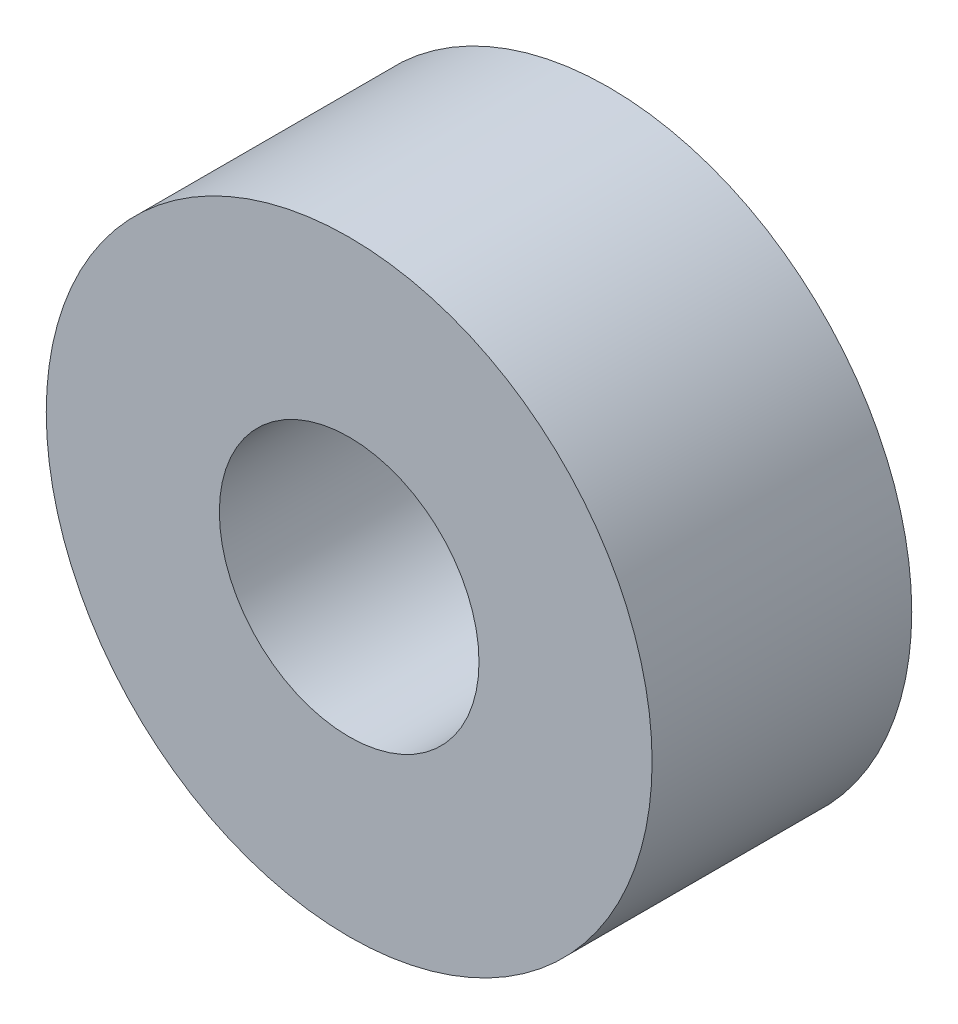
ISO-10303-21;
HEADER;
FILE_DESCRIPTION(('STEP AP214'),'2;1');
FILE_NAME('part.step','',(''),(''),'','','');
FILE_SCHEMA(('AUTOMOTIVE_DESIGN { 1 0 10303 214 1 1 1 1 }'));
ENDSEC;
DATA;
#1=APPLICATION_CONTEXT('core data for automotive mechanical design processes');
#2=APPLICATION_PROTOCOL_DEFINITION('international standard','automotive_design',2000,#1);
#3=PRODUCT_CONTEXT('',#1,'mechanical');
#4=PRODUCT('Part','Part','',(#3));
#5=PRODUCT_RELATED_PRODUCT_CATEGORY('part','',(#4));
#6=PRODUCT_DEFINITION_FORMATION('','',#4);
#7=PRODUCT_DEFINITION_CONTEXT('part definition',#1,'design');
#8=PRODUCT_DEFINITION('design','',#6,#7);
#9=PRODUCT_DEFINITION_SHAPE('','',#8);
#10=(LENGTH_UNIT() NAMED_UNIT(*) SI_UNIT(.MILLI.,.METRE.));
#11=(NAMED_UNIT(*) PLANE_ANGLE_UNIT() SI_UNIT($,.RADIAN.));
#12=(NAMED_UNIT(*) SI_UNIT($,.STERADIAN.) SOLID_ANGLE_UNIT());
#13=UNCERTAINTY_MEASURE_WITH_UNIT(LENGTH_MEASURE(1.E-05),#10,'distance_accuracy_value','');
#14=(GEOMETRIC_REPRESENTATION_CONTEXT(3) GLOBAL_UNCERTAINTY_ASSIGNED_CONTEXT((#13)) GLOBAL_UNIT_ASSIGNED_CONTEXT((#10,
#11,#12)) REPRESENTATION_CONTEXT('',''));
#15=CARTESIAN_POINT('',(0.,0.,0.));
#16=DIRECTION('',(0.,0.,1.));
#17=DIRECTION('',(1.,0.,0.));
#18=AXIS2_PLACEMENT_3D('',#15,#16,#17);
#19=CARTESIAN_POINT('',(0.,0.,9.525));
#20=DIRECTION('',(0.,0.,1.));
#21=DIRECTION('',(1.,0.,0.));
#22=AXIS2_PLACEMENT_3D('',#19,#20,#21);
#23=PLANE('',#22);
#24=CARTESIAN_POINT('',(0.,0.,9.525));
#25=DIRECTION('',(0.,0.,1.));
#26=DIRECTION('',(1.,0.,0.));
#27=AXIS2_PLACEMENT_3D('',#24,#25,#26);
#28=CIRCLE('',#27,11.1125);
#29=CARTESIAN_POINT('',(-11.1125,0.,9.525));
#30=VERTEX_POINT('',#29);
#31=EDGE_CURVE('E10',#30,#30,#28,.T.);
#32=ORIENTED_EDGE('',*,*,#31,.T.);
#33=EDGE_LOOP('',(#32));
#34=FACE_BOUND('',#33,.T.);
#35=CARTESIAN_POINT('',(0.,0.,9.525));
#36=DIRECTION('',(0.,0.,1.));
#37=DIRECTION('',(1.,0.,0.));
#38=AXIS2_PLACEMENT_3D('',#35,#36,#37);
#39=CIRCLE('',#38,4.7625);
#40=CARTESIAN_POINT('',(-4.7625,0.,9.525));
#41=VERTEX_POINT('',#40);
#42=EDGE_CURVE('E50',#41,#41,#39,.T.);
#43=ORIENTED_EDGE('',*,*,#42,.F.);
#44=EDGE_LOOP('',(#43));
#45=FACE_BOUND('',#44,.T.);
#46=ADVANCED_FACE('F37',(#34,#45),#23,.T.);
#47=CARTESIAN_POINT('',(0.,0.,0.));
#48=DIRECTION('',(0.,0.,1.));
#49=DIRECTION('',(1.,0.,0.));
#50=AXIS2_PLACEMENT_3D('',#47,#48,#49);
#51=PLANE('',#50);
#52=CARTESIAN_POINT('',(0.,0.,0.));
#53=DIRECTION('',(0.,0.,1.));
#54=DIRECTION('',(1.,0.,0.));
#55=AXIS2_PLACEMENT_3D('',#52,#53,#54);
#56=CIRCLE('',#55,11.1125);
#57=CARTESIAN_POINT('',(-11.1125,0.,0.));
#58=VERTEX_POINT('',#57);
#59=EDGE_CURVE('E41',#58,#58,#56,.T.);
#60=ORIENTED_EDGE('',*,*,#59,.F.);
#61=EDGE_LOOP('',(#60));
#62=FACE_BOUND('',#61,.T.);
#63=CARTESIAN_POINT('',(0.,0.,0.));
#64=DIRECTION('',(0.,0.,1.));
#65=DIRECTION('',(1.,0.,0.));
#66=AXIS2_PLACEMENT_3D('',#63,#64,#65);
#67=CIRCLE('',#66,4.7625);
#68=CARTESIAN_POINT('',(-4.7625,0.,0.));
#69=VERTEX_POINT('',#68);
#70=EDGE_CURVE('E52',#69,#69,#67,.T.);
#71=ORIENTED_EDGE('',*,*,#70,.T.);
#72=EDGE_LOOP('',(#71));
#73=FACE_BOUND('',#72,.T.);
#74=ADVANCED_FACE('F64',(#62,#73),#51,.F.);
#75=CARTESIAN_POINT('',(0.,0.,9.525));
#76=DIRECTION('',(0.,0.,-1.));
#77=DIRECTION('',(-1.,0.,0.));
#78=AXIS2_PLACEMENT_3D('',#75,#76,#77);
#79=CYLINDRICAL_SURFACE('',#78,11.1125);
#80=CARTESIAN_POINT('',(-11.1125,0.,9.525));
#81=CARTESIAN_POINT('',(-11.1125,0.,9.42578125));
#82=CARTESIAN_POINT('',(-11.1125,0.,9.3265625));
#83=CARTESIAN_POINT('',(-11.1125,0.,9.128125));
#84=CARTESIAN_POINT('',(-11.1125,0.,9.02890625));
#85=CARTESIAN_POINT('',(-11.1125,0.,8.83046875));
#86=CARTESIAN_POINT('',(-11.1125,0.,8.73125));
#87=CARTESIAN_POINT('',(-11.1125,0.,8.5328125));
#88=CARTESIAN_POINT('',(-11.1125,0.,8.43359375));
#89=CARTESIAN_POINT('',(-11.1125,0.,8.23515625));
#90=CARTESIAN_POINT('',(-11.1125,0.,8.1359375));
#91=CARTESIAN_POINT('',(-11.1125,0.,7.9375));
#92=CARTESIAN_POINT('',(-11.1125,0.,7.83828125));
#93=CARTESIAN_POINT('',(-11.1125,0.,7.63984375));
#94=CARTESIAN_POINT('',(-11.1125,0.,7.540625));
#95=CARTESIAN_POINT('',(-11.1125,0.,7.3421875));
#96=CARTESIAN_POINT('',(-11.1125,0.,7.24296875));
#97=CARTESIAN_POINT('',(-11.1125,0.,7.04453125));
#98=CARTESIAN_POINT('',(-11.1125,0.,6.9453125));
#99=CARTESIAN_POINT('',(-11.1125,0.,6.746875));
#100=CARTESIAN_POINT('',(-11.1125,0.,6.64765625));
#101=CARTESIAN_POINT('',(-11.1125,0.,6.44921875));
#102=CARTESIAN_POINT('',(-11.1125,0.,6.35));
#103=CARTESIAN_POINT('',(-11.1125,0.,6.1515625));
#104=CARTESIAN_POINT('',(-11.1125,0.,6.05234375));
#105=CARTESIAN_POINT('',(-11.1125,0.,5.85390625));
#106=CARTESIAN_POINT('',(-11.1125,0.,5.7546875));
#107=CARTESIAN_POINT('',(-11.1125,0.,5.55625));
#108=CARTESIAN_POINT('',(-11.1125,0.,5.45703125));
#109=CARTESIAN_POINT('',(-11.1125,0.,5.25859375));
#110=CARTESIAN_POINT('',(-11.1125,0.,5.159375));
#111=CARTESIAN_POINT('',(-11.1125,0.,4.9609375));
#112=CARTESIAN_POINT('',(-11.1125,0.,4.86171875));
#113=CARTESIAN_POINT('',(-11.1125,0.,4.66328125));
#114=CARTESIAN_POINT('',(-11.1125,0.,4.5640625));
#115=CARTESIAN_POINT('',(-11.1125,0.,4.365625));
#116=CARTESIAN_POINT('',(-11.1125,0.,4.26640625));
#117=CARTESIAN_POINT('',(-11.1125,0.,4.06796875));
#118=CARTESIAN_POINT('',(-11.1125,0.,3.96875));
#119=CARTESIAN_POINT('',(-11.1125,0.,3.7703125));
#120=CARTESIAN_POINT('',(-11.1125,0.,3.67109375));
#121=CARTESIAN_POINT('',(-11.1125,0.,3.47265625));
#122=CARTESIAN_POINT('',(-11.1125,0.,3.3734375));
#123=CARTESIAN_POINT('',(-11.1125,0.,3.175));
#124=CARTESIAN_POINT('',(-11.1125,0.,3.07578125));
#125=CARTESIAN_POINT('',(-11.1125,0.,2.87734375));
#126=CARTESIAN_POINT('',(-11.1125,0.,2.778125));
#127=CARTESIAN_POINT('',(-11.1125,0.,2.5796875));
#128=CARTESIAN_POINT('',(-11.1125,0.,2.48046875));
#129=CARTESIAN_POINT('',(-11.1125,0.,2.28203125));
#130=CARTESIAN_POINT('',(-11.1125,0.,2.1828125));
#131=CARTESIAN_POINT('',(-11.1125,0.,1.984375));
#132=CARTESIAN_POINT('',(-11.1125,0.,1.88515625));
#133=CARTESIAN_POINT('',(-11.1125,0.,1.68671875));
#134=CARTESIAN_POINT('',(-11.1125,0.,1.5875));
#135=CARTESIAN_POINT('',(-11.1125,0.,1.3890625));
#136=CARTESIAN_POINT('',(-11.1125,0.,1.28984375));
#137=CARTESIAN_POINT('',(-11.1125,0.,1.09140625));
#138=CARTESIAN_POINT('',(-11.1125,0.,0.992187500000001));
#139=CARTESIAN_POINT('',(-11.1125,0.,0.793750000000001));
#140=CARTESIAN_POINT('',(-11.1125,0.,0.69453125));
#141=CARTESIAN_POINT('',(-11.1125,0.,0.49609375));
#142=CARTESIAN_POINT('',(-11.1125,0.,0.396875));
#143=CARTESIAN_POINT('',(-11.1125,0.,0.1984375));
#144=CARTESIAN_POINT('',(-11.1125,0.,0.0992187500000001));
#145=CARTESIAN_POINT('',(-11.1125,0.,0.));
#146=B_SPLINE_CURVE_WITH_KNOTS('',3,(#80,#81,#82,#83,#84,#85,#86,#87,#88,#89,#90,#91,#92,#93,
#94,#95,#96,#97,#98,#99,#100,#101,#102,#103,#104,#105,#106,#107,#108,#109,#110,#111,#112,#113,
#114,#115,#116,#117,#118,#119,#120,#121,#122,#123,#124,#125,#126,#127,#128,#129,#130,#131,#132,
#133,#134,#135,#136,#137,#138,#139,#140,#141,#142,#143,#144,#145),.UNSPECIFIED.,.F.,.F.,(4,2,2,
2,2,2,2,2,2,2,2,2,2,2,2,2,2,2,2,2,2,2,2,2,2,2,2,2,2,2,2,2,4),(0.,0.297656249999998,
0.595312499999999,0.892968749999999,1.190625,1.48828125,1.7859375,2.08359375,2.38125,2.67890625,
2.9765625,3.27421875,3.571875,3.86953125,4.1671875,4.46484375,4.7625,5.06015625,5.3578125,
5.65546875,5.953125,6.25078125,6.5484375,6.84609375,7.14375,7.44140625,7.7390625,8.03671875,
8.334375,8.63203125,8.9296875,9.22734375,9.525),.UNSPECIFIED.);
#147=EDGE_CURVE('BSEAM39',#30,#58,#146,.T.);
#148=ORIENTED_EDGE('',*,*,#31,.F.);
#149=ORIENTED_EDGE('',*,*,#59,.T.);
#150=ORIENTED_EDGE('',*,*,#147,.T.);
#151=ORIENTED_EDGE('',*,*,#147,.F.);
#152=EDGE_LOOP('',(#148,#150,#149,#151));
#153=FACE_BOUND('',#152,.T.);
#154=ADVANCED_FACE('F39',(#153),#79,.T.);
#155=CARTESIAN_POINT('',(0.,0.,9.525));
#156=DIRECTION('',(0.,0.,-1.));
#157=DIRECTION('',(-1.,0.,0.));
#158=AXIS2_PLACEMENT_3D('',#155,#156,#157);
#159=CYLINDRICAL_SURFACE('',#158,4.7625);
#160=CARTESIAN_POINT('',(-4.7625,0.,9.525));
#161=CARTESIAN_POINT('',(-4.7625,0.,9.42578125));
#162=CARTESIAN_POINT('',(-4.7625,0.,9.3265625));
#163=CARTESIAN_POINT('',(-4.7625,0.,9.128125));
#164=CARTESIAN_POINT('',(-4.7625,0.,9.02890625));
#165=CARTESIAN_POINT('',(-4.7625,0.,8.83046875));
#166=CARTESIAN_POINT('',(-4.7625,0.,8.73125));
#167=CARTESIAN_POINT('',(-4.7625,0.,8.5328125));
#168=CARTESIAN_POINT('',(-4.7625,0.,8.43359375));
#169=CARTESIAN_POINT('',(-4.7625,0.,8.23515625));
#170=CARTESIAN_POINT('',(-4.7625,0.,8.1359375));
#171=CARTESIAN_POINT('',(-4.7625,0.,7.9375));
#172=CARTESIAN_POINT('',(-4.7625,0.,7.83828125));
#173=CARTESIAN_POINT('',(-4.7625,0.,7.63984375));
#174=CARTESIAN_POINT('',(-4.7625,0.,7.540625));
#175=CARTESIAN_POINT('',(-4.7625,0.,7.3421875));
#176=CARTESIAN_POINT('',(-4.7625,0.,7.24296875));
#177=CARTESIAN_POINT('',(-4.7625,0.,7.04453125));
#178=CARTESIAN_POINT('',(-4.7625,0.,6.9453125));
#179=CARTESIAN_POINT('',(-4.7625,0.,6.746875));
#180=CARTESIAN_POINT('',(-4.7625,0.,6.64765625));
#181=CARTESIAN_POINT('',(-4.7625,0.,6.44921875));
#182=CARTESIAN_POINT('',(-4.7625,0.,6.35));
#183=CARTESIAN_POINT('',(-4.7625,0.,6.1515625));
#184=CARTESIAN_POINT('',(-4.7625,0.,6.05234375));
#185=CARTESIAN_POINT('',(-4.7625,0.,5.85390625));
#186=CARTESIAN_POINT('',(-4.7625,0.,5.7546875));
#187=CARTESIAN_POINT('',(-4.7625,0.,5.55625));
#188=CARTESIAN_POINT('',(-4.7625,0.,5.45703125));
#189=CARTESIAN_POINT('',(-4.7625,0.,5.25859375));
#190=CARTESIAN_POINT('',(-4.7625,0.,5.159375));
#191=CARTESIAN_POINT('',(-4.7625,0.,4.9609375));
#192=CARTESIAN_POINT('',(-4.7625,0.,4.86171875));
#193=CARTESIAN_POINT('',(-4.7625,0.,4.66328125));
#194=CARTESIAN_POINT('',(-4.7625,0.,4.5640625));
#195=CARTESIAN_POINT('',(-4.7625,0.,4.365625));
#196=CARTESIAN_POINT('',(-4.7625,0.,4.26640625));
#197=CARTESIAN_POINT('',(-4.7625,0.,4.06796875));
#198=CARTESIAN_POINT('',(-4.7625,0.,3.96875));
#199=CARTESIAN_POINT('',(-4.7625,0.,3.7703125));
#200=CARTESIAN_POINT('',(-4.7625,0.,3.67109375));
#201=CARTESIAN_POINT('',(-4.7625,0.,3.47265625));
#202=CARTESIAN_POINT('',(-4.7625,0.,3.3734375));
#203=CARTESIAN_POINT('',(-4.7625,0.,3.175));
#204=CARTESIAN_POINT('',(-4.7625,0.,3.07578125));
#205=CARTESIAN_POINT('',(-4.7625,0.,2.87734375));
#206=CARTESIAN_POINT('',(-4.7625,0.,2.778125));
#207=CARTESIAN_POINT('',(-4.7625,0.,2.5796875));
#208=CARTESIAN_POINT('',(-4.7625,0.,2.48046875));
#209=CARTESIAN_POINT('',(-4.7625,0.,2.28203125));
#210=CARTESIAN_POINT('',(-4.7625,0.,2.1828125));
#211=CARTESIAN_POINT('',(-4.7625,0.,1.984375));
#212=CARTESIAN_POINT('',(-4.7625,0.,1.88515625));
#213=CARTESIAN_POINT('',(-4.7625,0.,1.68671875));
#214=CARTESIAN_POINT('',(-4.7625,0.,1.5875));
#215=CARTESIAN_POINT('',(-4.7625,0.,1.3890625));
#216=CARTESIAN_POINT('',(-4.7625,0.,1.28984375));
#217=CARTESIAN_POINT('',(-4.7625,0.,1.09140625));
#218=CARTESIAN_POINT('',(-4.7625,0.,0.992187500000001));
#219=CARTESIAN_POINT('',(-4.7625,0.,0.793750000000001));
#220=CARTESIAN_POINT('',(-4.7625,0.,0.69453125));
#221=CARTESIAN_POINT('',(-4.7625,0.,0.49609375));
#222=CARTESIAN_POINT('',(-4.7625,0.,0.396875));
#223=CARTESIAN_POINT('',(-4.7625,0.,0.1984375));
#224=CARTESIAN_POINT('',(-4.7625,0.,0.0992187500000001));
#225=CARTESIAN_POINT('',(-4.7625,0.,0.));
#226=B_SPLINE_CURVE_WITH_KNOTS('',3,(#160,#161,#162,#163,#164,#165,#166,#167,#168,#169,#170,
#171,#172,#173,#174,#175,#176,#177,#178,#179,#180,#181,#182,#183,#184,#185,#186,#187,#188,#189,
#190,#191,#192,#193,#194,#195,#196,#197,#198,#199,#200,#201,#202,#203,#204,#205,#206,#207,#208,
#209,#210,#211,#212,#213,#214,#215,#216,#217,#218,#219,#220,#221,#222,#223,#224,#225),
.UNSPECIFIED.,.F.,.F.,(4,2,2,2,2,2,2,2,2,2,2,2,2,2,2,2,2,2,2,2,2,2,2,2,2,2,2,2,2,2,2,2,4),(0.,
0.29765625,0.5953125,0.892968750000001,1.190625,1.48828125,1.7859375,2.08359375,2.38125,
2.67890625,2.9765625,3.27421875,3.571875,3.86953125,4.1671875,4.46484375,4.7625,5.06015625,
5.3578125,5.65546875,5.953125,6.25078125,6.5484375,6.84609375,7.14375,7.44140625,7.7390625,
8.03671875,8.334375,8.63203125,8.9296875,9.22734375,9.525),.UNSPECIFIED.);
#227=EDGE_CURVE('BSEAM60',#41,#69,#226,.T.);
#228=ORIENTED_EDGE('',*,*,#42,.T.);
#229=ORIENTED_EDGE('',*,*,#70,.F.);
#230=ORIENTED_EDGE('',*,*,#227,.T.);
#231=ORIENTED_EDGE('',*,*,#227,.F.);
#232=EDGE_LOOP('',(#228,#230,#229,#231));
#233=FACE_BOUND('',#232,.T.);
#234=ADVANCED_FACE('F60',(#233),#159,.F.);
#235=CLOSED_SHELL('',(#46,#74,#154,#234));
#236=MANIFOLD_SOLID_BREP('B2',#235);
#237=ADVANCED_BREP_SHAPE_REPRESENTATION('',(#18,#236),#14);
#238=SHAPE_DEFINITION_REPRESENTATION(#9,#237);
ENDSEC;
END-ISO-10303-21;
